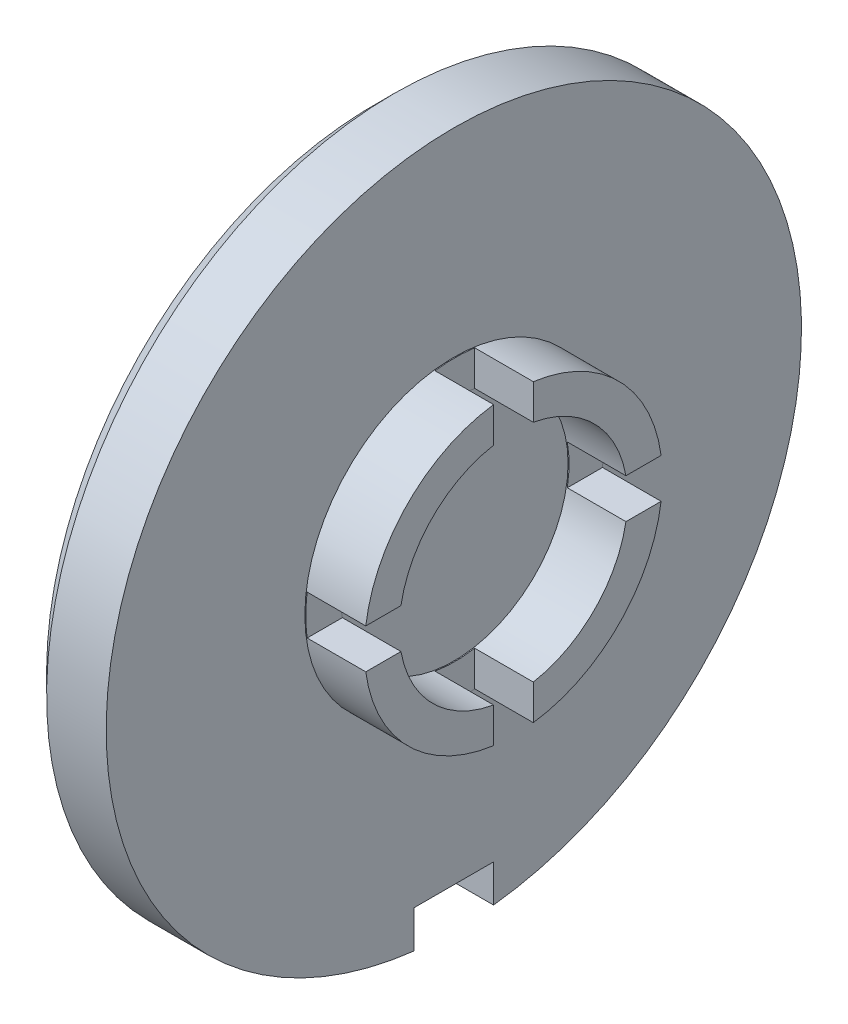
ISO-10303-21;
HEADER;
FILE_DESCRIPTION(('STEP AP214'),'2;1');
FILE_NAME('part.step','',(''),(''),'','','');
FILE_SCHEMA(('AUTOMOTIVE_DESIGN { 1 0 10303 214 1 1 1 1 }'));
ENDSEC;
DATA;
#1=APPLICATION_CONTEXT('core data for automotive mechanical design processes');
#2=APPLICATION_PROTOCOL_DEFINITION('international standard','automotive_design',2000,#1);
#3=PRODUCT_CONTEXT('',#1,'mechanical');
#4=PRODUCT('Part','Part','',(#3));
#5=PRODUCT_RELATED_PRODUCT_CATEGORY('part','',(#4));
#6=PRODUCT_DEFINITION_FORMATION('','',#4);
#7=PRODUCT_DEFINITION_CONTEXT('part definition',#1,'design');
#8=PRODUCT_DEFINITION('design','',#6,#7);
#9=PRODUCT_DEFINITION_SHAPE('','',#8);
#10=(LENGTH_UNIT() NAMED_UNIT(*) SI_UNIT(.MILLI.,.METRE.));
#11=(NAMED_UNIT(*) PLANE_ANGLE_UNIT() SI_UNIT($,.RADIAN.));
#12=(NAMED_UNIT(*) SI_UNIT($,.STERADIAN.) SOLID_ANGLE_UNIT());
#13=UNCERTAINTY_MEASURE_WITH_UNIT(LENGTH_MEASURE(1.E-05),#10,'distance_accuracy_value','');
#14=(GEOMETRIC_REPRESENTATION_CONTEXT(3) GLOBAL_UNCERTAINTY_ASSIGNED_CONTEXT((#13)) GLOBAL_UNIT_ASSIGNED_CONTEXT((#10,
#11,#12)) REPRESENTATION_CONTEXT('',''));
#15=CARTESIAN_POINT('',(0.,0.,0.));
#16=DIRECTION('',(0.,0.,1.));
#17=DIRECTION('',(1.,0.,0.));
#18=AXIS2_PLACEMENT_3D('',#15,#16,#17);
#19=CARTESIAN_POINT('',(-85.6,-65.,-52.));
#20=DIRECTION('',(1.,0.,0.));
#21=DIRECTION('',(0.,0.,-1.));
#22=AXIS2_PLACEMENT_3D('',#19,#20,#21);
#23=PLANE('',#22);
#24=DIRECTION('',(0.,1.,0.));
#25=VECTOR('',#24,1.);
#26=CARTESIAN_POINT('',(-85.6,-65.,-51.2));
#27=LINE('',#26,#25);
#28=CARTESIAN_POINT('',(-85.6,-71.5513357416637,-51.2));
#29=VERTEX_POINT('',#28);
#30=CARTESIAN_POINT('',(-85.6,-71.2,-51.2));
#31=VERTEX_POINT('',#30);
#32=EDGE_CURVE('E359',#29,#31,#27,.T.);
#33=ORIENTED_EDGE('',*,*,#32,.F.);
#34=CARTESIAN_POINT('',(-85.6,-65.,-52.));
#35=DIRECTION('',(-1.,0.,0.));
#36=DIRECTION('',(0.,0.,1.));
#37=AXIS2_PLACEMENT_3D('',#34,#35,#36);
#38=CIRCLE('',#37,6.6);
#39=CARTESIAN_POINT('',(-85.6,-71.5513357416637,-52.8));
#40=VERTEX_POINT('',#39);
#41=EDGE_CURVE('E260',#29,#40,#38,.T.);
#42=ORIENTED_EDGE('',*,*,#41,.T.);
#43=DIRECTION('',(0.,1.,0.));
#44=VECTOR('',#43,1.);
#45=CARTESIAN_POINT('',(-85.6,-65.,-52.8));
#46=LINE('',#45,#44);
#47=CARTESIAN_POINT('',(-85.6,-71.2,-52.8));
#48=VERTEX_POINT('',#47);
#49=EDGE_CURVE('E395',#40,#48,#46,.T.);
#50=ORIENTED_EDGE('',*,*,#49,.T.);
#51=DIRECTION('',(0.,0.,-1.));
#52=VECTOR('',#51,1.);
#53=CARTESIAN_POINT('',(-85.6,-71.2,-52.));
#54=LINE('',#53,#52);
#55=EDGE_CURVE('E205',#31,#48,#54,.T.);
#56=ORIENTED_EDGE('',*,*,#55,.F.);
#57=EDGE_LOOP('',(#33,#42,#50,#56));
#58=FACE_BOUND('',#57,.T.);
#59=ADVANCED_FACE('F47',(#58),#23,.F.);
#60=CARTESIAN_POINT('',(-85.2,-65.,-52.));
#61=DIRECTION('',(1.,0.,0.));
#62=DIRECTION('',(0.,0.,-1.));
#63=AXIS2_PLACEMENT_3D('',#60,#61,#62);
#64=CONICAL_SURFACE('',#63,7.,0.785398163397466);
#65=CARTESIAN_POINT('',(-84.3053728090001,-72.8539886990545,-51.2));
#66=CARTESIAN_POINT('',(-84.4879933170182,-72.6704216279594,-51.2));
#67=CARTESIAN_POINT('',(-84.6705824210977,-72.4868233002689,-51.2));
#68=CARTESIAN_POINT('',(-85.0356779759848,-72.1195446095986,-51.2));
#69=CARTESIAN_POINT('',(-85.2181844268204,-71.9358642466467,-51.2));
#70=CARTESIAN_POINT('',(-85.5830949808418,-71.5684018115597,-51.2));
#71=CARTESIAN_POINT('',(-85.7654990840124,-71.3846197394094,-51.2));
#72=CARTESIAN_POINT('',(-86.1301724326838,-71.0169217300399,-51.2));
#73=CARTESIAN_POINT('',(-86.3124416781385,-70.8330057927748,-51.2));
#74=CARTESIAN_POINT('',(-86.4946271909999,-70.6490068941078,-51.2));
#75=B_SPLINE_CURVE_WITH_KNOTS('',3,(#65,#66,#67,#68,#69,#70,#71,#72,#73,#74),.UNSPECIFIED.,.F.,
.F.,(4,2,2,2,4),(0.,0.776803766800077,1.55360727032155,2.33041088964957,3.10721477439802),.UNSPECIFIED.);
#76=CARTESIAN_POINT('',(-85.2,-71.9541354602855,-51.2));
#77=VERTEX_POINT('',#76);
#78=EDGE_CURVE('E362',#77,#29,#75,.T.);
#79=ORIENTED_EDGE('',*,*,#78,.F.);
#80=CARTESIAN_POINT('',(-85.2,-65.,-52.));
#81=DIRECTION('',(-1.,0.,0.));
#82=DIRECTION('',(0.,0.,1.));
#83=AXIS2_PLACEMENT_3D('',#80,#81,#82);
#84=CIRCLE('',#83,7.);
#85=CARTESIAN_POINT('',(-85.2,-71.9541354602855,-52.8));
#86=VERTEX_POINT('',#85);
#87=EDGE_CURVE('E264',#77,#86,#84,.T.);
#88=ORIENTED_EDGE('',*,*,#87,.T.);
#89=CARTESIAN_POINT('',(-84.3053728090001,-72.8539886990545,-52.8));
#90=CARTESIAN_POINT('',(-84.4879933170182,-72.6704216279594,-52.8));
#91=CARTESIAN_POINT('',(-84.6705824210977,-72.4868233002689,-52.8));
#92=CARTESIAN_POINT('',(-85.0356779759848,-72.1195446095986,-52.8));
#93=CARTESIAN_POINT('',(-85.2181844268204,-71.9358642466467,-52.8));
#94=CARTESIAN_POINT('',(-85.5830949808418,-71.5684018115597,-52.8));
#95=CARTESIAN_POINT('',(-85.7654990840124,-71.3846197394094,-52.8));
#96=CARTESIAN_POINT('',(-86.1301724326838,-71.0169217300399,-52.8));
#97=CARTESIAN_POINT('',(-86.3124416781385,-70.8330057927748,-52.8));
#98=CARTESIAN_POINT('',(-86.4946271909999,-70.6490068941078,-52.8));
#99=B_SPLINE_CURVE_WITH_KNOTS('',3,(#89,#90,#91,#92,#93,#94,#95,#96,#97,#98),.UNSPECIFIED.,.F.,
.F.,(4,2,2,2,4),(0.,0.776803766800077,1.55360727032155,2.33041088964957,3.10721477439802),.UNSPECIFIED.);
#100=EDGE_CURVE('E387',#86,#40,#99,.T.);
#101=ORIENTED_EDGE('',*,*,#100,.T.);
#102=ORIENTED_EDGE('',*,*,#41,.F.);
#103=EDGE_LOOP('',(#79,#88,#101,#102));
#104=FACE_BOUND('',#103,.T.);
#105=ADVANCED_FACE('F373',(#104),#64,.T.);
#106=CARTESIAN_POINT('',(-90.6,-65.,-52.));
#107=DIRECTION('',(-1.,0.,0.));
#108=DIRECTION('',(0.,0.,1.));
#109=AXIS2_PLACEMENT_3D('',#106,#107,#108);
#110=CYLINDRICAL_SURFACE('',#109,7.);
#111=DIRECTION('',(-1.,0.,0.));
#112=VECTOR('',#111,1.);
#113=CARTESIAN_POINT('',(-90.6,-71.9541354602855,-51.2));
#114=LINE('',#113,#112);
#115=CARTESIAN_POINT('',(-84.,-71.9541354602855,-51.2));
#116=VERTEX_POINT('',#115);
#117=EDGE_CURVE('E371',#116,#77,#114,.T.);
#118=ORIENTED_EDGE('',*,*,#117,.F.);
#119=CARTESIAN_POINT('',(-84.,-65.,-52.));
#120=DIRECTION('',(-1.,0.,0.));
#121=DIRECTION('',(0.,0.,1.));
#122=AXIS2_PLACEMENT_3D('',#119,#120,#121);
#123=CIRCLE('',#122,7.);
#124=CARTESIAN_POINT('',(-84.,-71.9541354602855,-52.8));
#125=VERTEX_POINT('',#124);
#126=EDGE_CURVE('E268',#116,#125,#123,.T.);
#127=ORIENTED_EDGE('',*,*,#126,.T.);
#128=DIRECTION('',(-1.,0.,0.));
#129=VECTOR('',#128,1.);
#130=CARTESIAN_POINT('',(-90.6,-71.9541354602855,-52.8));
#131=LINE('',#130,#129);
#132=EDGE_CURVE('E63',#125,#86,#131,.T.);
#133=ORIENTED_EDGE('',*,*,#132,.T.);
#134=ORIENTED_EDGE('',*,*,#87,.F.);
#135=EDGE_LOOP('',(#118,#127,#133,#134));
#136=FACE_BOUND('',#135,.T.);
#137=ADVANCED_FACE('F406',(#136),#110,.T.);
#138=CARTESIAN_POINT('',(-84.,-58.,-52.));
#139=DIRECTION('',(-1.,0.,0.));
#140=DIRECTION('',(0.,0.,1.));
#141=AXIS2_PLACEMENT_3D('',#138,#139,#140);
#142=PLANE('',#141);
#143=CARTESIAN_POINT('',(-84.,-65.,-52.));
#144=DIRECTION('',(-1.,0.,0.));
#145=DIRECTION('',(0.,0.,1.));
#146=AXIS2_PLACEMENT_3D('',#143,#144,#145);
#147=CIRCLE('',#146,3.);
#148=CARTESIAN_POINT('',(-84.,-65.,-49.));
#149=VERTEX_POINT('',#148);
#150=EDGE_CURVE('E271',#149,#149,#147,.T.);
#151=ORIENTED_EDGE('',*,*,#150,.T.);
#152=EDGE_LOOP('',(#151));
#153=FACE_BOUND('',#152,.T.);
#154=DIRECTION('',(0.,-1.,0.));
#155=VECTOR('',#154,1.);
#156=CARTESIAN_POINT('',(-84.,-58.,-51.2));
#157=LINE('',#156,#155);
#158=CARTESIAN_POINT('',(-84.,-71.2,-51.2));
#159=VERTEX_POINT('',#158);
#160=EDGE_CURVE('E11',#159,#116,#157,.T.);
#161=ORIENTED_EDGE('',*,*,#160,.F.);
#162=DIRECTION('',(0.,0.,1.));
#163=VECTOR('',#162,1.);
#164=CARTESIAN_POINT('',(-84.,-71.2,-52.));
#165=LINE('',#164,#163);
#166=CARTESIAN_POINT('',(-84.,-71.2,-52.8));
#167=VERTEX_POINT('',#166);
#168=EDGE_CURVE('E56',#167,#159,#165,.T.);
#169=ORIENTED_EDGE('',*,*,#168,.F.);
#170=DIRECTION('',(0.,-1.,0.));
#171=VECTOR('',#170,1.);
#172=CARTESIAN_POINT('',(-84.,-58.,-52.8));
#173=LINE('',#172,#171);
#174=EDGE_CURVE('E188',#167,#125,#173,.T.);
#175=ORIENTED_EDGE('',*,*,#174,.T.);
#176=ORIENTED_EDGE('',*,*,#126,.F.);
#177=EDGE_LOOP('',(#161,#169,#175,#176));
#178=FACE_BOUND('',#177,.T.);
#179=ADVANCED_FACE('F210',(#153,#178),#142,.F.);
#180=CARTESIAN_POINT('',(-82.8,-62.,-52.));
#181=DIRECTION('',(-1.,0.,0.));
#182=DIRECTION('',(0.,0.,1.));
#183=AXIS2_PLACEMENT_3D('',#180,#181,#182);
#184=PLANE('',#183);
#185=DIRECTION('',(0.,-1.,0.));
#186=VECTOR('',#185,1.);
#187=CARTESIAN_POINT('',(-82.8,-62.,-51.6));
#188=LINE('',#187,#186);
#189=CARTESIAN_POINT('',(-82.8,-67.2649503305812,-51.6));
#190=VERTEX_POINT('',#189);
#191=CARTESIAN_POINT('',(-82.8,-67.9732137494637,-51.6));
#192=VERTEX_POINT('',#191);
#193=EDGE_CURVE('E324',#190,#192,#188,.T.);
#194=ORIENTED_EDGE('',*,*,#193,.F.);
#195=CARTESIAN_POINT('',(-82.8,-65.,-52.));
#196=DIRECTION('',(-1.,0.,0.));
#197=DIRECTION('',(0.,0.,1.));
#198=AXIS2_PLACEMENT_3D('',#195,#196,#197);
#199=CIRCLE('',#198,2.3);
#200=CARTESIAN_POINT('',(-82.8,-65.4,-49.7350496694188));
#201=VERTEX_POINT('',#200);
#202=EDGE_CURVE('E259',#190,#201,#199,.T.);
#203=ORIENTED_EDGE('',*,*,#202,.T.);
#204=DIRECTION('',(0.,0.,-1.));
#205=VECTOR('',#204,1.);
#206=CARTESIAN_POINT('',(-82.8,-65.4,-52.));
#207=LINE('',#206,#205);
#208=CARTESIAN_POINT('',(-82.8,-65.4,-49.0267862505363));
#209=VERTEX_POINT('',#208);
#210=EDGE_CURVE('E293',#209,#201,#207,.T.);
#211=ORIENTED_EDGE('',*,*,#210,.F.);
#212=CARTESIAN_POINT('',(-82.8,-65.,-52.));
#213=DIRECTION('',(-1.,0.,0.));
#214=DIRECTION('',(0.,0.,1.));
#215=AXIS2_PLACEMENT_3D('',#212,#213,#214);
#216=CIRCLE('',#215,3.);
#217=EDGE_CURVE('E280',#192,#209,#216,.T.);
#218=ORIENTED_EDGE('',*,*,#217,.F.);
#219=EDGE_LOOP('',(#194,#203,#211,#218));
#220=FACE_BOUND('',#219,.T.);
#221=ADVANCED_FACE('F431',(#220),#184,.F.);
#222=DIRECTION('',(0.,-1.,0.));
#223=VECTOR('',#222,1.);
#224=CARTESIAN_POINT('',(-82.8,-62.,-51.6));
#225=LINE('',#224,#223);
#226=CARTESIAN_POINT('',(-82.8,-62.0267862505363,-51.6));
#227=VERTEX_POINT('',#226);
#228=CARTESIAN_POINT('',(-82.8,-62.7350496694188,-51.6));
#229=VERTEX_POINT('',#228);
#230=EDGE_CURVE('E330',#227,#229,#225,.T.);
#231=ORIENTED_EDGE('',*,*,#230,.F.);
#232=CARTESIAN_POINT('',(-82.8,-64.6,-49.0267862505363));
#233=VERTEX_POINT('',#232);
#234=EDGE_CURVE('E275',#233,#227,#216,.T.);
#235=ORIENTED_EDGE('',*,*,#234,.F.);
#236=DIRECTION('',(0.,0.,1.));
#237=VECTOR('',#236,1.);
#238=CARTESIAN_POINT('',(-82.8,-64.6,-52.));
#239=LINE('',#238,#237);
#240=CARTESIAN_POINT('',(-82.8,-64.6,-49.7350496694188));
#241=VERTEX_POINT('',#240);
#242=EDGE_CURVE('E300',#241,#233,#239,.T.);
#243=ORIENTED_EDGE('',*,*,#242,.F.);
#244=EDGE_CURVE('E249',#241,#229,#199,.T.);
#245=ORIENTED_EDGE('',*,*,#244,.T.);
#246=EDGE_LOOP('',(#231,#235,#243,#245));
#247=FACE_BOUND('',#246,.T.);
#248=ADVANCED_FACE('F423',(#247),#184,.F.);
#249=CARTESIAN_POINT('',(-90.6,-65.,-52.));
#250=DIRECTION('',(-1.,0.,0.));
#251=DIRECTION('',(0.,0.,1.));
#252=AXIS2_PLACEMENT_3D('',#249,#250,#251);
#253=CYLINDRICAL_SURFACE('',#252,2.3);
#254=CARTESIAN_POINT('',(-84.,-65.,-52.));
#255=DIRECTION('',(-1.,0.,0.));
#256=DIRECTION('',(0.,0.,1.));
#257=AXIS2_PLACEMENT_3D('',#254,#255,#256);
#258=CIRCLE('',#257,2.3);
#259=CARTESIAN_POINT('',(-84.,-65.,-49.7));
#260=VERTEX_POINT('',#259);
#261=EDGE_CURVE('E255',#260,#260,#258,.T.);
#262=ORIENTED_EDGE('',*,*,#261,.T.);
#263=EDGE_LOOP('',(#262));
#264=FACE_BOUND('',#263,.T.);
#265=DIRECTION('',(-1.,0.,0.));
#266=VECTOR('',#265,1.);
#267=CARTESIAN_POINT('',(-90.6,-67.2649503305812,-51.6));
#268=LINE('',#267,#266);
#269=CARTESIAN_POINT('',(-83.98,-67.2649503305812,-51.6));
#270=VERTEX_POINT('',#269);
#271=EDGE_CURVE('E321',#270,#190,#268,.F.);
#272=ORIENTED_EDGE('',*,*,#271,.F.);
#273=CARTESIAN_POINT('',(-83.98,-65.,-52.));
#274=DIRECTION('',(1.,0.,0.));
#275=DIRECTION('',(0.,0.,-1.));
#276=AXIS2_PLACEMENT_3D('',#273,#274,#275);
#277=CIRCLE('',#276,2.3);
#278=CARTESIAN_POINT('',(-83.98,-67.2649503305812,-52.4));
#279=VERTEX_POINT('',#278);
#280=EDGE_CURVE('E317',#279,#270,#277,.F.);
#281=ORIENTED_EDGE('',*,*,#280,.F.);
#282=DIRECTION('',(-1.,0.,0.));
#283=VECTOR('',#282,1.);
#284=CARTESIAN_POINT('',(-90.6,-67.2649503305812,-52.4));
#285=LINE('',#284,#283);
#286=CARTESIAN_POINT('',(-82.8,-67.2649503305812,-52.4));
#287=VERTEX_POINT('',#286);
#288=EDGE_CURVE('E333',#279,#287,#285,.F.);
#289=ORIENTED_EDGE('',*,*,#288,.T.);
#290=CARTESIAN_POINT('',(-82.8,-65.4,-54.2649503305812));
#291=VERTEX_POINT('',#290);
#292=EDGE_CURVE('E254',#291,#287,#199,.T.);
#293=ORIENTED_EDGE('',*,*,#292,.F.);
#294=DIRECTION('',(-1.,0.,0.));
#295=VECTOR('',#294,1.);
#296=CARTESIAN_POINT('',(-90.6,-65.4,-54.2649503305812));
#297=LINE('',#296,#295);
#298=CARTESIAN_POINT('',(-83.98,-65.4,-54.2649503305812));
#299=VERTEX_POINT('',#298);
#300=EDGE_CURVE('E286',#299,#291,#297,.F.);
#301=ORIENTED_EDGE('',*,*,#300,.F.);
#302=CARTESIAN_POINT('',(-83.98,-65.,-52.));
#303=DIRECTION('',(1.,0.,0.));
#304=DIRECTION('',(0.,0.,-1.));
#305=AXIS2_PLACEMENT_3D('',#302,#303,#304);
#306=CIRCLE('',#305,2.3);
#307=CARTESIAN_POINT('',(-83.98,-64.6,-54.2649503305812));
#308=VERTEX_POINT('',#307);
#309=EDGE_CURVE('E282',#308,#299,#306,.F.);
#310=ORIENTED_EDGE('',*,*,#309,.F.);
#311=DIRECTION('',(-1.,0.,0.));
#312=VECTOR('',#311,1.);
#313=CARTESIAN_POINT('',(-90.6,-64.6,-54.2649503305812));
#314=LINE('',#313,#312);
#315=CARTESIAN_POINT('',(-82.8,-64.6,-54.2649503305812));
#316=VERTEX_POINT('',#315);
#317=EDGE_CURVE('E301',#316,#308,#314,.T.);
#318=ORIENTED_EDGE('',*,*,#317,.F.);
#319=CARTESIAN_POINT('',(-82.8,-62.7350496694188,-52.4));
#320=VERTEX_POINT('',#319);
#321=EDGE_CURVE('E253',#320,#316,#199,.T.);
#322=ORIENTED_EDGE('',*,*,#321,.F.);
#323=DIRECTION('',(-1.,0.,0.));
#324=VECTOR('',#323,1.);
#325=CARTESIAN_POINT('',(-90.6,-62.7350496694188,-52.4));
#326=LINE('',#325,#324);
#327=CARTESIAN_POINT('',(-83.98,-62.7350496694188,-52.4));
#328=VERTEX_POINT('',#327);
#329=EDGE_CURVE('E341',#320,#328,#326,.T.);
#330=ORIENTED_EDGE('',*,*,#329,.T.);
#331=CARTESIAN_POINT('',(-83.98,-62.7350496694188,-51.6));
#332=VERTEX_POINT('',#331);
#333=EDGE_CURVE('E318',#332,#328,#277,.F.);
#334=ORIENTED_EDGE('',*,*,#333,.F.);
#335=DIRECTION('',(-1.,0.,0.));
#336=VECTOR('',#335,1.);
#337=CARTESIAN_POINT('',(-90.6,-62.7350496694188,-51.6));
#338=LINE('',#337,#336);
#339=EDGE_CURVE('E327',#229,#332,#338,.T.);
#340=ORIENTED_EDGE('',*,*,#339,.F.);
#341=ORIENTED_EDGE('',*,*,#244,.F.);
#342=DIRECTION('',(-1.,0.,0.));
#343=VECTOR('',#342,1.);
#344=CARTESIAN_POINT('',(-90.6,-64.6,-49.7350496694188));
#345=LINE('',#344,#343);
#346=CARTESIAN_POINT('',(-83.98,-64.6,-49.7350496694188));
#347=VERTEX_POINT('',#346);
#348=EDGE_CURVE('E297',#347,#241,#345,.F.);
#349=ORIENTED_EDGE('',*,*,#348,.F.);
#350=CARTESIAN_POINT('',(-83.98,-65.4,-49.7350496694188));
#351=VERTEX_POINT('',#350);
#352=EDGE_CURVE('E285',#351,#347,#306,.F.);
#353=ORIENTED_EDGE('',*,*,#352,.F.);
#354=DIRECTION('',(-1.,0.,0.));
#355=VECTOR('',#354,1.);
#356=CARTESIAN_POINT('',(-90.6,-65.4,-49.7350496694188));
#357=LINE('',#356,#355);
#358=EDGE_CURVE('E290',#201,#351,#357,.T.);
#359=ORIENTED_EDGE('',*,*,#358,.F.);
#360=ORIENTED_EDGE('',*,*,#202,.F.);
#361=EDGE_LOOP('',(#272,#281,#289,#293,#301,#310,#318,#322,#330,#334,#340,#341,#349,#353,#359,#360));
#362=FACE_BOUND('',#361,.T.);
#363=ADVANCED_FACE('F420',(#264,#362),#253,.F.);
#364=CARTESIAN_POINT('',(-90.6,-65.,-52.));
#365=DIRECTION('',(-1.,0.,0.));
#366=DIRECTION('',(0.,0.,1.));
#367=AXIS2_PLACEMENT_3D('',#364,#365,#366);
#368=CYLINDRICAL_SURFACE('',#367,3.);
#369=ORIENTED_EDGE('',*,*,#150,.F.);
#370=EDGE_LOOP('',(#369));
#371=FACE_BOUND('',#370,.T.);
#372=DIRECTION('',(-1.,0.,0.));
#373=VECTOR('',#372,1.);
#374=CARTESIAN_POINT('',(-90.6,-67.9732137494637,-51.6));
#375=LINE('',#374,#373);
#376=CARTESIAN_POINT('',(-83.98,-67.9732137494637,-51.6));
#377=VERTEX_POINT('',#376);
#378=EDGE_CURVE('E198',#192,#377,#375,.T.);
#379=ORIENTED_EDGE('',*,*,#378,.F.);
#380=ORIENTED_EDGE('',*,*,#217,.T.);
#381=DIRECTION('',(-1.,0.,0.));
#382=VECTOR('',#381,1.);
#383=CARTESIAN_POINT('',(-90.6,-65.4,-49.0267862505363));
#384=LINE('',#383,#382);
#385=CARTESIAN_POINT('',(-83.98,-65.4,-49.0267862505363));
#386=VERTEX_POINT('',#385);
#387=EDGE_CURVE('E230',#386,#209,#384,.F.);
#388=ORIENTED_EDGE('',*,*,#387,.F.);
#389=CARTESIAN_POINT('',(-83.98,-65.,-52.));
#390=DIRECTION('',(1.,0.,0.));
#391=DIRECTION('',(0.,0.,-1.));
#392=AXIS2_PLACEMENT_3D('',#389,#390,#391);
#393=CIRCLE('',#392,3.);
#394=CARTESIAN_POINT('',(-83.98,-64.6,-49.0267862505363));
#395=VERTEX_POINT('',#394);
#396=EDGE_CURVE('E234',#395,#386,#393,.T.);
#397=ORIENTED_EDGE('',*,*,#396,.F.);
#398=DIRECTION('',(-1.,0.,0.));
#399=VECTOR('',#398,1.);
#400=CARTESIAN_POINT('',(-90.6,-64.6,-49.0267862505363));
#401=LINE('',#400,#399);
#402=EDGE_CURVE('E235',#233,#395,#401,.T.);
#403=ORIENTED_EDGE('',*,*,#402,.F.);
#404=ORIENTED_EDGE('',*,*,#234,.T.);
#405=DIRECTION('',(-1.,0.,0.));
#406=VECTOR('',#405,1.);
#407=CARTESIAN_POINT('',(-90.6,-62.0267862505363,-51.6));
#408=LINE('',#407,#406);
#409=CARTESIAN_POINT('',(-83.98,-62.0267862505363,-51.6));
#410=VERTEX_POINT('',#409);
#411=EDGE_CURVE('E220',#410,#227,#408,.F.);
#412=ORIENTED_EDGE('',*,*,#411,.F.);
#413=CARTESIAN_POINT('',(-83.98,-65.,-52.));
#414=DIRECTION('',(1.,0.,0.));
#415=DIRECTION('',(0.,0.,-1.));
#416=AXIS2_PLACEMENT_3D('',#413,#414,#415);
#417=CIRCLE('',#416,3.);
#418=CARTESIAN_POINT('',(-83.98,-62.0267862505363,-52.4));
#419=VERTEX_POINT('',#418);
#420=EDGE_CURVE('E223',#419,#410,#417,.T.);
#421=ORIENTED_EDGE('',*,*,#420,.F.);
#422=DIRECTION('',(-1.,0.,0.));
#423=VECTOR('',#422,1.);
#424=CARTESIAN_POINT('',(-90.6,-62.0267862505363,-52.4));
#425=LINE('',#424,#423);
#426=CARTESIAN_POINT('',(-82.8,-62.0267862505363,-52.4));
#427=VERTEX_POINT('',#426);
#428=EDGE_CURVE('E226',#419,#427,#425,.F.);
#429=ORIENTED_EDGE('',*,*,#428,.T.);
#430=CARTESIAN_POINT('',(-82.8,-64.6,-54.9732137494637));
#431=VERTEX_POINT('',#430);
#432=EDGE_CURVE('E279',#427,#431,#216,.T.);
#433=ORIENTED_EDGE('',*,*,#432,.T.);
#434=DIRECTION('',(-1.,0.,0.));
#435=VECTOR('',#434,1.);
#436=CARTESIAN_POINT('',(-90.6,-64.6,-54.9732137494637));
#437=LINE('',#436,#435);
#438=CARTESIAN_POINT('',(-83.98,-64.6,-54.9732137494637));
#439=VERTEX_POINT('',#438);
#440=EDGE_CURVE('E245',#439,#431,#437,.F.);
#441=ORIENTED_EDGE('',*,*,#440,.F.);
#442=CARTESIAN_POINT('',(-83.98,-65.4,-54.9732137494637));
#443=VERTEX_POINT('',#442);
#444=EDGE_CURVE('E241',#443,#439,#393,.T.);
#445=ORIENTED_EDGE('',*,*,#444,.F.);
#446=DIRECTION('',(-1.,0.,0.));
#447=VECTOR('',#446,1.);
#448=CARTESIAN_POINT('',(-90.6,-65.4,-54.9732137494637));
#449=LINE('',#448,#447);
#450=CARTESIAN_POINT('',(-82.8,-65.4,-54.9732137494637));
#451=VERTEX_POINT('',#450);
#452=EDGE_CURVE('E238',#451,#443,#449,.T.);
#453=ORIENTED_EDGE('',*,*,#452,.F.);
#454=CARTESIAN_POINT('',(-82.8,-67.9732137494637,-52.4));
#455=VERTEX_POINT('',#454);
#456=EDGE_CURVE('E281',#451,#455,#216,.T.);
#457=ORIENTED_EDGE('',*,*,#456,.T.);
#458=DIRECTION('',(-1.,0.,0.));
#459=VECTOR('',#458,1.);
#460=CARTESIAN_POINT('',(-90.6,-67.9732137494637,-52.4));
#461=LINE('',#460,#459);
#462=CARTESIAN_POINT('',(-83.98,-67.9732137494637,-52.4));
#463=VERTEX_POINT('',#462);
#464=EDGE_CURVE('E216',#455,#463,#461,.T.);
#465=ORIENTED_EDGE('',*,*,#464,.T.);
#466=EDGE_CURVE('E215',#377,#463,#417,.T.);
#467=ORIENTED_EDGE('',*,*,#466,.F.);
#468=EDGE_LOOP('',(#379,#380,#388,#397,#403,#404,#412,#421,#429,#433,#441,#445,#453,#457,#465,#467));
#469=FACE_BOUND('',#468,.T.);
#470=ADVANCED_FACE('F422',(#371,#469),#368,.T.);
#471=ORIENTED_EDGE('',*,*,#292,.T.);
#472=DIRECTION('',(0.,-1.,0.));
#473=VECTOR('',#472,1.);
#474=CARTESIAN_POINT('',(-82.8,-62.,-52.4));
#475=LINE('',#474,#473);
#476=EDGE_CURVE('E337',#287,#455,#475,.T.);
#477=ORIENTED_EDGE('',*,*,#476,.T.);
#478=ORIENTED_EDGE('',*,*,#456,.F.);
#479=EDGE_CURVE('E289',#291,#451,#207,.T.);
#480=ORIENTED_EDGE('',*,*,#479,.F.);
#481=EDGE_LOOP('',(#471,#477,#478,#480));
#482=FACE_BOUND('',#481,.T.);
#483=ADVANCED_FACE('F49',(#482),#184,.F.);
#484=ORIENTED_EDGE('',*,*,#432,.F.);
#485=DIRECTION('',(0.,-1.,0.));
#486=VECTOR('',#485,1.);
#487=CARTESIAN_POINT('',(-82.8,-62.,-52.4));
#488=LINE('',#487,#486);
#489=EDGE_CURVE('E345',#427,#320,#488,.T.);
#490=ORIENTED_EDGE('',*,*,#489,.T.);
#491=ORIENTED_EDGE('',*,*,#321,.T.);
#492=EDGE_CURVE('E304',#431,#316,#239,.T.);
#493=ORIENTED_EDGE('',*,*,#492,.F.);
#494=EDGE_LOOP('',(#484,#490,#491,#493));
#495=FACE_BOUND('',#494,.T.);
#496=ADVANCED_FACE('F418',(#495),#184,.F.);
#497=CARTESIAN_POINT('',(-84.,-62.7,-52.));
#498=DIRECTION('',(-1.,0.,0.));
#499=DIRECTION('',(0.,0.,1.));
#500=AXIS2_PLACEMENT_3D('',#497,#498,#499);
#501=PLANE('',#500);
#502=ORIENTED_EDGE('',*,*,#261,.F.);
#503=EDGE_LOOP('',(#502));
#504=FACE_BOUND('',#503,.T.);
#505=ADVANCED_FACE('F415',(#504),#501,.F.);
#506=CARTESIAN_POINT('',(-83.98,-65.4,-48.8));
#507=DIRECTION('',(0.,1.,0.));
#508=DIRECTION('',(0.,0.,1.));
#509=AXIS2_PLACEMENT_3D('',#506,#507,#508);
#510=PLANE('',#509);
#511=ORIENTED_EDGE('',*,*,#300,.T.);
#512=ORIENTED_EDGE('',*,*,#479,.T.);
#513=ORIENTED_EDGE('',*,*,#452,.T.);
#514=DIRECTION('',(0.,0.,-1.));
#515=VECTOR('',#514,1.);
#516=CARTESIAN_POINT('',(-83.98,-65.4,-48.8));
#517=LINE('',#516,#515);
#518=EDGE_CURVE('E309',#299,#443,#517,.T.);
#519=ORIENTED_EDGE('',*,*,#518,.F.);
#520=EDGE_LOOP('',(#511,#512,#513,#519));
#521=FACE_BOUND('',#520,.T.);
#522=ADVANCED_FACE('F417',(#521),#510,.T.);
#523=CARTESIAN_POINT('',(-83.98,-64.6,-48.8));
#524=DIRECTION('',(0.,-1.,0.));
#525=DIRECTION('',(0.,0.,-1.));
#526=AXIS2_PLACEMENT_3D('',#523,#524,#525);
#527=PLANE('',#526);
#528=ORIENTED_EDGE('',*,*,#317,.T.);
#529=DIRECTION('',(0.,0.,-1.));
#530=VECTOR('',#529,1.);
#531=CARTESIAN_POINT('',(-83.98,-64.6,-48.8));
#532=LINE('',#531,#530);
#533=EDGE_CURVE('E314',#308,#439,#532,.T.);
#534=ORIENTED_EDGE('',*,*,#533,.T.);
#535=ORIENTED_EDGE('',*,*,#440,.T.);
#536=ORIENTED_EDGE('',*,*,#492,.T.);
#537=EDGE_LOOP('',(#528,#534,#535,#536));
#538=FACE_BOUND('',#537,.T.);
#539=ADVANCED_FACE('F461',(#538),#527,.T.);
#540=CARTESIAN_POINT('',(-83.98,-65.4,-48.8));
#541=DIRECTION('',(1.,0.,0.));
#542=DIRECTION('',(0.,0.,-1.));
#543=AXIS2_PLACEMENT_3D('',#540,#541,#542);
#544=PLANE('',#543);
#545=ORIENTED_EDGE('',*,*,#309,.T.);
#546=ORIENTED_EDGE('',*,*,#518,.T.);
#547=ORIENTED_EDGE('',*,*,#444,.T.);
#548=ORIENTED_EDGE('',*,*,#533,.F.);
#549=EDGE_LOOP('',(#545,#546,#547,#548));
#550=FACE_BOUND('',#549,.T.);
#551=ADVANCED_FACE('F484',(#550),#544,.T.);
#552=ORIENTED_EDGE('',*,*,#352,.T.);
#553=EDGE_CURVE('E313',#395,#347,#532,.T.);
#554=ORIENTED_EDGE('',*,*,#553,.F.);
#555=ORIENTED_EDGE('',*,*,#396,.T.);
#556=EDGE_CURVE('E308',#386,#351,#517,.T.);
#557=ORIENTED_EDGE('',*,*,#556,.T.);
#558=EDGE_LOOP('',(#552,#554,#555,#557));
#559=FACE_BOUND('',#558,.T.);
#560=ADVANCED_FACE('F486',(#559),#544,.T.);
#561=ORIENTED_EDGE('',*,*,#358,.T.);
#562=ORIENTED_EDGE('',*,*,#556,.F.);
#563=ORIENTED_EDGE('',*,*,#387,.T.);
#564=ORIENTED_EDGE('',*,*,#210,.T.);
#565=EDGE_LOOP('',(#561,#562,#563,#564));
#566=FACE_BOUND('',#565,.T.);
#567=ADVANCED_FACE('F491',(#566),#510,.T.);
#568=ORIENTED_EDGE('',*,*,#348,.T.);
#569=ORIENTED_EDGE('',*,*,#242,.T.);
#570=ORIENTED_EDGE('',*,*,#402,.T.);
#571=ORIENTED_EDGE('',*,*,#553,.T.);
#572=EDGE_LOOP('',(#568,#569,#570,#571));
#573=FACE_BOUND('',#572,.T.);
#574=ADVANCED_FACE('F495',(#573),#527,.T.);
#575=CARTESIAN_POINT('',(0.,0.,-52.4));
#576=DIRECTION('',(0.,0.,-1.));
#577=DIRECTION('',(-1.,0.,0.));
#578=AXIS2_PLACEMENT_3D('',#575,#576,#577);
#579=PLANE('',#578);
#580=ORIENTED_EDGE('',*,*,#489,.F.);
#581=ORIENTED_EDGE('',*,*,#428,.F.);
#582=DIRECTION('',(0.,-1.,0.));
#583=VECTOR('',#582,1.);
#584=CARTESIAN_POINT('',(-83.98,-68.2,-52.4));
#585=LINE('',#584,#583);
#586=EDGE_CURVE('E352',#419,#328,#585,.T.);
#587=ORIENTED_EDGE('',*,*,#586,.T.);
#588=ORIENTED_EDGE('',*,*,#329,.F.);
#589=EDGE_LOOP('',(#580,#581,#587,#588));
#590=FACE_BOUND('',#589,.T.);
#591=ADVANCED_FACE('F573',(#590),#579,.F.);
#592=CARTESIAN_POINT('',(0.,0.,-51.6));
#593=DIRECTION('',(0.,0.,-1.));
#594=DIRECTION('',(-1.,0.,0.));
#595=AXIS2_PLACEMENT_3D('',#592,#593,#594);
#596=PLANE('',#595);
#597=ORIENTED_EDGE('',*,*,#339,.T.);
#598=DIRECTION('',(0.,-1.,0.));
#599=VECTOR('',#598,1.);
#600=CARTESIAN_POINT('',(-83.98,-68.2,-51.6));
#601=LINE('',#600,#599);
#602=EDGE_CURVE('E349',#410,#332,#601,.T.);
#603=ORIENTED_EDGE('',*,*,#602,.F.);
#604=ORIENTED_EDGE('',*,*,#411,.T.);
#605=ORIENTED_EDGE('',*,*,#230,.T.);
#606=EDGE_LOOP('',(#597,#603,#604,#605));
#607=FACE_BOUND('',#606,.T.);
#608=ADVANCED_FACE('F591',(#607),#596,.T.);
#609=CARTESIAN_POINT('',(-83.98,-68.2,-51.6));
#610=DIRECTION('',(1.,0.,0.));
#611=DIRECTION('',(0.,0.,-1.));
#612=AXIS2_PLACEMENT_3D('',#609,#610,#611);
#613=PLANE('',#612);
#614=ORIENTED_EDGE('',*,*,#333,.T.);
#615=ORIENTED_EDGE('',*,*,#586,.F.);
#616=ORIENTED_EDGE('',*,*,#420,.T.);
#617=ORIENTED_EDGE('',*,*,#602,.T.);
#618=EDGE_LOOP('',(#614,#615,#616,#617));
#619=FACE_BOUND('',#618,.T.);
#620=ADVANCED_FACE('F600',(#619),#613,.T.);
#621=ORIENTED_EDGE('',*,*,#280,.T.);
#622=EDGE_CURVE('E353',#270,#377,#601,.T.);
#623=ORIENTED_EDGE('',*,*,#622,.T.);
#624=ORIENTED_EDGE('',*,*,#466,.T.);
#625=EDGE_CURVE('E71',#279,#463,#585,.T.);
#626=ORIENTED_EDGE('',*,*,#625,.F.);
#627=EDGE_LOOP('',(#621,#623,#624,#626));
#628=FACE_BOUND('',#627,.T.);
#629=ADVANCED_FACE('F477',(#628),#613,.T.);
#630=ORIENTED_EDGE('',*,*,#271,.T.);
#631=ORIENTED_EDGE('',*,*,#193,.T.);
#632=ORIENTED_EDGE('',*,*,#378,.T.);
#633=ORIENTED_EDGE('',*,*,#622,.F.);
#634=EDGE_LOOP('',(#630,#631,#632,#633));
#635=FACE_BOUND('',#634,.T.);
#636=ADVANCED_FACE('F442',(#635),#596,.T.);
#637=ORIENTED_EDGE('',*,*,#625,.T.);
#638=ORIENTED_EDGE('',*,*,#464,.F.);
#639=ORIENTED_EDGE('',*,*,#476,.F.);
#640=ORIENTED_EDGE('',*,*,#288,.F.);
#641=EDGE_LOOP('',(#637,#638,#639,#640));
#642=FACE_BOUND('',#641,.T.);
#643=ADVANCED_FACE('F475',(#642),#579,.F.);
#644=CARTESIAN_POINT('',(-85.7,-71.2,-51.2));
#645=DIRECTION('',(0.,-1.,0.));
#646=DIRECTION('',(0.,0.,-1.));
#647=AXIS2_PLACEMENT_3D('',#644,#645,#646);
#648=PLANE('',#647);
#649=ORIENTED_EDGE('',*,*,#55,.T.);
#650=DIRECTION('',(-1.,0.,0.));
#651=VECTOR('',#650,1.);
#652=CARTESIAN_POINT('',(-85.7,-71.2,-52.8));
#653=LINE('',#652,#651);
#654=EDGE_CURVE('E191',#167,#48,#653,.T.);
#655=ORIENTED_EDGE('',*,*,#654,.F.);
#656=ORIENTED_EDGE('',*,*,#168,.T.);
#657=DIRECTION('',(-1.,0.,0.));
#658=VECTOR('',#657,1.);
#659=CARTESIAN_POINT('',(-85.7,-71.2,-51.2));
#660=LINE('',#659,#658);
#661=EDGE_CURVE('E207',#159,#31,#660,.T.);
#662=ORIENTED_EDGE('',*,*,#661,.T.);
#663=EDGE_LOOP('',(#649,#655,#656,#662));
#664=FACE_BOUND('',#663,.T.);
#665=ADVANCED_FACE('F201',(#664),#648,.T.);
#666=CARTESIAN_POINT('',(0.,0.,-51.2));
#667=DIRECTION('',(0.,0.,-1.));
#668=DIRECTION('',(-1.,0.,0.));
#669=AXIS2_PLACEMENT_3D('',#666,#667,#668);
#670=PLANE('',#669);
#671=ORIENTED_EDGE('',*,*,#32,.T.);
#672=ORIENTED_EDGE('',*,*,#661,.F.);
#673=ORIENTED_EDGE('',*,*,#160,.T.);
#674=ORIENTED_EDGE('',*,*,#117,.T.);
#675=ORIENTED_EDGE('',*,*,#78,.T.);
#676=EDGE_LOOP('',(#671,#672,#673,#674,#675));
#677=FACE_BOUND('',#676,.T.);
#678=ADVANCED_FACE('F377',(#677),#670,.T.);
#679=CARTESIAN_POINT('',(0.,0.,-52.8));
#680=DIRECTION('',(0.,0.,-1.));
#681=DIRECTION('',(-1.,0.,0.));
#682=AXIS2_PLACEMENT_3D('',#679,#680,#681);
#683=PLANE('',#682);
#684=ORIENTED_EDGE('',*,*,#100,.F.);
#685=ORIENTED_EDGE('',*,*,#132,.F.);
#686=ORIENTED_EDGE('',*,*,#174,.F.);
#687=ORIENTED_EDGE('',*,*,#654,.T.);
#688=ORIENTED_EDGE('',*,*,#49,.F.);
#689=EDGE_LOOP('',(#684,#685,#686,#687,#688));
#690=FACE_BOUND('',#689,.T.);
#691=ADVANCED_FACE('F190',(#690),#683,.F.);
#692=CLOSED_SHELL('',(#59,#105,#137,#179,#221,#248,#363,#470,#483,#496,#505,#522,#539,#551,#560,
#567,#574,#591,#608,#620,#629,#636,#643,#665,#678,#691));
#693=MANIFOLD_SOLID_BREP('B2',#692);
#694=ADVANCED_BREP_SHAPE_REPRESENTATION('',(#18,#693),#14);
#695=SHAPE_DEFINITION_REPRESENTATION(#9,#694);
ENDSEC;
END-ISO-10303-21;
